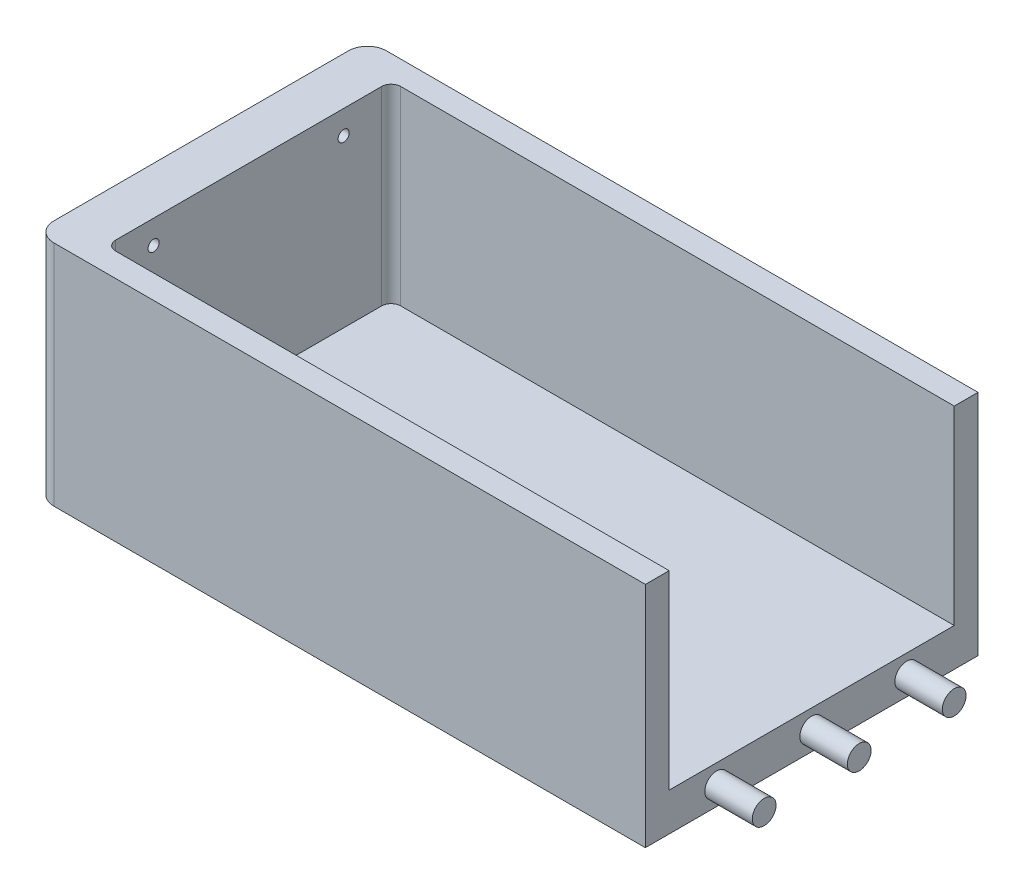
ISO-10303-21;
HEADER;
FILE_DESCRIPTION(('STEP AP214'),'2;1');
FILE_NAME('part.step','',(''),(''),'','','');
FILE_SCHEMA(('AUTOMOTIVE_DESIGN { 1 0 10303 214 1 1 1 1 }'));
ENDSEC;
DATA;
#1=APPLICATION_CONTEXT('core data for automotive mechanical design processes');
#2=APPLICATION_PROTOCOL_DEFINITION('international standard','automotive_design',2000,#1);
#3=PRODUCT_CONTEXT('',#1,'mechanical');
#4=PRODUCT('Part','Part','',(#3));
#5=PRODUCT_RELATED_PRODUCT_CATEGORY('part','',(#4));
#6=PRODUCT_DEFINITION_FORMATION('','',#4);
#7=PRODUCT_DEFINITION_CONTEXT('part definition',#1,'design');
#8=PRODUCT_DEFINITION('design','',#6,#7);
#9=PRODUCT_DEFINITION_SHAPE('','',#8);
#10=(LENGTH_UNIT() NAMED_UNIT(*) SI_UNIT(.MILLI.,.METRE.));
#11=(NAMED_UNIT(*) PLANE_ANGLE_UNIT() SI_UNIT($,.RADIAN.));
#12=(NAMED_UNIT(*) SI_UNIT($,.STERADIAN.) SOLID_ANGLE_UNIT());
#13=UNCERTAINTY_MEASURE_WITH_UNIT(LENGTH_MEASURE(1.E-05),#10,'distance_accuracy_value','');
#14=(GEOMETRIC_REPRESENTATION_CONTEXT(3) GLOBAL_UNCERTAINTY_ASSIGNED_CONTEXT((#13)) GLOBAL_UNIT_ASSIGNED_CONTEXT((#10,
#11,#12)) REPRESENTATION_CONTEXT('',''));
#15=CARTESIAN_POINT('',(0.,0.,0.));
#16=DIRECTION('',(0.,0.,1.));
#17=DIRECTION('',(1.,0.,0.));
#18=AXIS2_PLACEMENT_3D('',#15,#16,#17);
#19=CARTESIAN_POINT('',(0.,0.,0.));
#20=DIRECTION('',(1.,0.,0.));
#21=DIRECTION('',(0.,0.,-1.));
#22=AXIS2_PLACEMENT_3D('',#19,#20,#21);
#23=PLANE('',#22);
#24=CARTESIAN_POINT('',(0.,-5.08000000000021,-25.4));
#25=DIRECTION('',(1.,0.,0.));
#26=DIRECTION('',(0.,0.,1.));
#27=AXIS2_PLACEMENT_3D('',#24,#25,#26);
#28=CIRCLE('',#27,3.175);
#29=CARTESIAN_POINT('',(0.,-5.08000000000021,-22.225));
#30=VERTEX_POINT('',#29);
#31=EDGE_CURVE('E526',#30,#30,#28,.T.);
#32=ORIENTED_EDGE('',*,*,#31,.F.);
#33=EDGE_LOOP('',(#32));
#34=FACE_BOUND('',#33,.T.);
#35=CARTESIAN_POINT('',(0.,-5.08000000000018,25.4));
#36=DIRECTION('',(1.,0.,0.));
#37=DIRECTION('',(0.,0.,-1.));
#38=AXIS2_PLACEMENT_3D('',#35,#36,#37);
#39=CIRCLE('',#38,3.175);
#40=CARTESIAN_POINT('',(0.,-5.08000000000018,22.225));
#41=VERTEX_POINT('',#40);
#42=EDGE_CURVE('E518',#41,#41,#39,.T.);
#43=ORIENTED_EDGE('',*,*,#42,.F.);
#44=EDGE_LOOP('',(#43));
#45=FACE_BOUND('',#44,.T.);
#46=CARTESIAN_POINT('',(0.,-5.08,0.));
#47=DIRECTION('',(1.,0.,0.));
#48=DIRECTION('',(0.,0.,-1.));
#49=AXIS2_PLACEMENT_3D('',#46,#47,#48);
#50=CIRCLE('',#49,3.175);
#51=CARTESIAN_POINT('',(0.,-5.08,-3.175));
#52=VERTEX_POINT('',#51);
#53=EDGE_CURVE('E175',#52,#52,#50,.T.);
#54=ORIENTED_EDGE('',*,*,#53,.F.);
#55=EDGE_LOOP('',(#54));
#56=FACE_BOUND('',#55,.T.);
#57=DIRECTION('',(0.,1.,0.));
#58=VECTOR('',#57,1.);
#59=CARTESIAN_POINT('',(0.,50.8,-38.0999999999999));
#60=LINE('',#59,#58);
#61=CARTESIAN_POINT('',(0.,0.,-38.0999999999999));
#62=VERTEX_POINT('',#61);
#63=CARTESIAN_POINT('',(0.,50.8,-38.0999999999999));
#64=VERTEX_POINT('',#63);
#65=EDGE_CURVE('E161',#62,#64,#60,.T.);
#66=ORIENTED_EDGE('',*,*,#65,.F.);
#67=DIRECTION('',(0.,0.,1.));
#68=VECTOR('',#67,1.);
#69=CARTESIAN_POINT('',(0.,0.,0.));
#70=LINE('',#69,#68);
#71=CARTESIAN_POINT('',(0.,0.,38.1));
#72=VERTEX_POINT('',#71);
#73=EDGE_CURVE('E142',#62,#72,#70,.T.);
#74=ORIENTED_EDGE('',*,*,#73,.T.);
#75=DIRECTION('',(0.,-1.,0.));
#76=VECTOR('',#75,1.);
#77=CARTESIAN_POINT('',(0.,50.8,38.1));
#78=LINE('',#77,#76);
#79=CARTESIAN_POINT('',(0.,50.8,38.1));
#80=VERTEX_POINT('',#79);
#81=EDGE_CURVE('E152',#80,#72,#78,.T.);
#82=ORIENTED_EDGE('',*,*,#81,.F.);
#83=DIRECTION('',(0.,0.,1.));
#84=VECTOR('',#83,1.);
#85=CARTESIAN_POINT('',(0.,50.8,0.));
#86=LINE('',#85,#84);
#87=CARTESIAN_POINT('',(0.,50.8,44.45));
#88=VERTEX_POINT('',#87);
#89=EDGE_CURVE('E222',#80,#88,#86,.T.);
#90=ORIENTED_EDGE('',*,*,#89,.T.);
#91=DIRECTION('',(0.,-1.,0.));
#92=VECTOR('',#91,1.);
#93=CARTESIAN_POINT('',(0.,50.8,44.45));
#94=LINE('',#93,#92);
#95=CARTESIAN_POINT('',(0.,-10.16,44.45));
#96=VERTEX_POINT('',#95);
#97=EDGE_CURVE('E166',#88,#96,#94,.T.);
#98=ORIENTED_EDGE('',*,*,#97,.T.);
#99=DIRECTION('',(0.,0.,1.));
#100=VECTOR('',#99,1.);
#101=CARTESIAN_POINT('',(0.,-10.16,0.));
#102=LINE('',#101,#100);
#103=CARTESIAN_POINT('',(0.,-10.16,-44.45));
#104=VERTEX_POINT('',#103);
#105=EDGE_CURVE('E160',#104,#96,#102,.T.);
#106=ORIENTED_EDGE('',*,*,#105,.F.);
#107=DIRECTION('',(0.,1.,0.));
#108=VECTOR('',#107,1.);
#109=CARTESIAN_POINT('',(0.,50.8,-44.45));
#110=LINE('',#109,#108);
#111=CARTESIAN_POINT('',(0.,50.8,-44.45));
#112=VERTEX_POINT('',#111);
#113=EDGE_CURVE('E172',#104,#112,#110,.T.);
#114=ORIENTED_EDGE('',*,*,#113,.T.);
#115=EDGE_CURVE('E221',#112,#64,#86,.T.);
#116=ORIENTED_EDGE('',*,*,#115,.T.);
#117=EDGE_LOOP('',(#66,#74,#82,#90,#98,#106,#114,#116));
#118=FACE_BOUND('',#117,.T.);
#119=ADVANCED_FACE('F45',(#34,#45,#56,#118),#23,.T.);
#120=CARTESIAN_POINT('',(0.,50.8,0.));
#121=DIRECTION('',(0.,-1.,0.));
#122=DIRECTION('',(0.,0.,-1.));
#123=AXIS2_PLACEMENT_3D('',#120,#121,#122);
#124=PLANE('',#123);
#125=ORIENTED_EDGE('',*,*,#115,.F.);
#126=DIRECTION('',(-1.,0.,0.));
#127=VECTOR('',#126,1.);
#128=CARTESIAN_POINT('',(-163.195,50.8,-44.45));
#129=LINE('',#128,#127);
#130=CARTESIAN_POINT('',(-158.115,50.8,-44.45));
#131=VERTEX_POINT('',#130);
#132=EDGE_CURVE('E71',#112,#131,#129,.T.);
#133=ORIENTED_EDGE('',*,*,#132,.T.);
#134=CARTESIAN_POINT('',(-158.115,50.8,-39.37));
#135=DIRECTION('',(0.,-1.,0.));
#136=DIRECTION('',(0.,0.,-1.));
#137=AXIS2_PLACEMENT_3D('',#134,#135,#136);
#138=CIRCLE('',#137,5.08);
#139=CARTESIAN_POINT('',(-163.195,50.8,-39.37));
#140=VERTEX_POINT('',#139);
#141=EDGE_CURVE('E241',#131,#140,#138,.F.);
#142=ORIENTED_EDGE('',*,*,#141,.T.);
#143=DIRECTION('',(0.,0.,1.));
#144=VECTOR('',#143,1.);
#145=CARTESIAN_POINT('',(-163.195,50.8,44.4500000000001));
#146=LINE('',#145,#144);
#147=CARTESIAN_POINT('',(-163.195,50.8,39.3700000000001));
#148=VERTEX_POINT('',#147);
#149=EDGE_CURVE('E182',#140,#148,#146,.T.);
#150=ORIENTED_EDGE('',*,*,#149,.T.);
#151=CARTESIAN_POINT('',(-158.115,50.8,39.3700000000001));
#152=DIRECTION('',(0.,-1.,0.));
#153=DIRECTION('',(0.,0.,-1.));
#154=AXIS2_PLACEMENT_3D('',#151,#152,#153);
#155=CIRCLE('',#154,5.08);
#156=CARTESIAN_POINT('',(-158.115,50.8,44.4500000000001));
#157=VERTEX_POINT('',#156);
#158=EDGE_CURVE('E246',#148,#157,#155,.F.);
#159=ORIENTED_EDGE('',*,*,#158,.T.);
#160=DIRECTION('',(1.,0.,0.));
#161=VECTOR('',#160,1.);
#162=CARTESIAN_POINT('',(-163.195,50.8,44.4500000000001));
#163=LINE('',#162,#161);
#164=EDGE_CURVE('E179',#157,#88,#163,.T.);
#165=ORIENTED_EDGE('',*,*,#164,.T.);
#166=ORIENTED_EDGE('',*,*,#89,.F.);
#167=DIRECTION('',(1.,0.,0.));
#168=VECTOR('',#167,1.);
#169=CARTESIAN_POINT('',(-150.495,50.8,38.1));
#170=LINE('',#169,#168);
#171=CARTESIAN_POINT('',(-147.955,50.8,38.1));
#172=VERTEX_POINT('',#171);
#173=EDGE_CURVE('E155',#172,#80,#170,.T.);
#174=ORIENTED_EDGE('',*,*,#173,.F.);
#175=CARTESIAN_POINT('',(-147.955,50.8,35.56));
#176=DIRECTION('',(0.,-1.,0.));
#177=DIRECTION('',(0.,0.,-1.));
#178=AXIS2_PLACEMENT_3D('',#175,#176,#177);
#179=CIRCLE('',#178,2.54);
#180=CARTESIAN_POINT('',(-150.495,50.8,35.56));
#181=VERTEX_POINT('',#180);
#182=EDGE_CURVE('E289',#172,#181,#179,.T.);
#183=ORIENTED_EDGE('',*,*,#182,.T.);
#184=DIRECTION('',(0.,0.,1.));
#185=VECTOR('',#184,1.);
#186=CARTESIAN_POINT('',(-150.495,50.8,38.1));
#187=LINE('',#186,#185);
#188=CARTESIAN_POINT('',(-150.495,50.8,-35.5599999999999));
#189=VERTEX_POINT('',#188);
#190=EDGE_CURVE('E188',#189,#181,#187,.T.);
#191=ORIENTED_EDGE('',*,*,#190,.F.);
#192=CARTESIAN_POINT('',(-147.955,50.8,-35.5599999999999));
#193=DIRECTION('',(0.,-1.,0.));
#194=DIRECTION('',(0.,0.,-1.));
#195=AXIS2_PLACEMENT_3D('',#192,#193,#194);
#196=CIRCLE('',#195,2.54);
#197=CARTESIAN_POINT('',(-147.955,50.8,-38.0999999999999));
#198=VERTEX_POINT('',#197);
#199=EDGE_CURVE('E217',#189,#198,#196,.T.);
#200=ORIENTED_EDGE('',*,*,#199,.T.);
#201=DIRECTION('',(-1.,0.,0.));
#202=VECTOR('',#201,1.);
#203=CARTESIAN_POINT('',(-150.495,50.8,-38.0999999999999));
#204=LINE('',#203,#202);
#205=EDGE_CURVE('E149',#64,#198,#204,.T.);
#206=ORIENTED_EDGE('',*,*,#205,.F.);
#207=EDGE_LOOP('',(#125,#133,#142,#150,#159,#165,#166,#174,#183,#191,#200,#206));
#208=FACE_BOUND('',#207,.T.);
#209=ADVANCED_FACE('F310',(#208),#124,.F.);
#210=CARTESIAN_POINT('',(-150.495,50.8,38.1));
#211=DIRECTION('',(0.,0.,-1.));
#212=DIRECTION('',(-1.,0.,0.));
#213=AXIS2_PLACEMENT_3D('',#210,#211,#212);
#214=PLANE('',#213);
#215=ORIENTED_EDGE('',*,*,#173,.T.);
#216=ORIENTED_EDGE('',*,*,#81,.T.);
#217=DIRECTION('',(1.,0.,0.));
#218=VECTOR('',#217,1.);
#219=CARTESIAN_POINT('',(-150.495,0.,38.1));
#220=LINE('',#219,#218);
#221=CARTESIAN_POINT('',(-147.955,0.,38.1));
#222=VERTEX_POINT('',#221);
#223=EDGE_CURVE('E138',#222,#72,#220,.T.);
#224=ORIENTED_EDGE('',*,*,#223,.F.);
#225=DIRECTION('',(0.,-1.,0.));
#226=VECTOR('',#225,1.);
#227=CARTESIAN_POINT('',(-147.955,50.8,38.1));
#228=LINE('',#227,#226);
#229=EDGE_CURVE('E297',#222,#172,#228,.F.);
#230=ORIENTED_EDGE('',*,*,#229,.T.);
#231=EDGE_LOOP('',(#215,#216,#224,#230));
#232=FACE_BOUND('',#231,.T.);
#233=ADVANCED_FACE('F153',(#232),#214,.T.);
#234=CARTESIAN_POINT('',(-147.955,50.8,35.56));
#235=DIRECTION('',(0.,1.,0.));
#236=DIRECTION('',(0.,0.,1.));
#237=AXIS2_PLACEMENT_3D('',#234,#235,#236);
#238=CYLINDRICAL_SURFACE('',#237,2.54);
#239=ORIENTED_EDGE('',*,*,#182,.F.);
#240=ORIENTED_EDGE('',*,*,#229,.F.);
#241=CARTESIAN_POINT('',(-147.955,0.,35.56));
#242=DIRECTION('',(0.,-1.,0.));
#243=DIRECTION('',(0.,0.,-1.));
#244=AXIS2_PLACEMENT_3D('',#241,#242,#243);
#245=CIRCLE('',#244,2.54);
#246=CARTESIAN_POINT('',(-150.495,0.,35.56));
#247=VERTEX_POINT('',#246);
#248=EDGE_CURVE('E144',#247,#222,#245,.F.);
#249=ORIENTED_EDGE('',*,*,#248,.F.);
#250=DIRECTION('',(0.,-1.,0.));
#251=VECTOR('',#250,1.);
#252=CARTESIAN_POINT('',(-150.495,0.,35.56));
#253=LINE('',#252,#251);
#254=EDGE_CURVE('E276',#181,#247,#253,.T.);
#255=ORIENTED_EDGE('',*,*,#254,.F.);
#256=EDGE_LOOP('',(#239,#240,#249,#255));
#257=FACE_BOUND('',#256,.T.);
#258=ADVANCED_FACE('F328',(#257),#238,.F.);
#259=CARTESIAN_POINT('',(-150.495,50.8,38.1));
#260=DIRECTION('',(1.,0.,0.));
#261=DIRECTION('',(0.,0.,-1.));
#262=AXIS2_PLACEMENT_3D('',#259,#260,#261);
#263=PLANE('',#262);
#264=ORIENTED_EDGE('',*,*,#190,.T.);
#265=ORIENTED_EDGE('',*,*,#254,.T.);
#266=DIRECTION('',(0.,0.,1.));
#267=VECTOR('',#266,1.);
#268=CARTESIAN_POINT('',(-150.495,0.,38.1));
#269=LINE('',#268,#267);
#270=CARTESIAN_POINT('',(-150.495,0.,-35.5599999999999));
#271=VERTEX_POINT('',#270);
#272=EDGE_CURVE('E148',#271,#247,#269,.T.);
#273=ORIENTED_EDGE('',*,*,#272,.F.);
#274=DIRECTION('',(0.,-1.,0.));
#275=VECTOR('',#274,1.);
#276=CARTESIAN_POINT('',(-150.495,50.8,-35.5599999999999));
#277=LINE('',#276,#275);
#278=EDGE_CURVE('E273',#271,#189,#277,.F.);
#279=ORIENTED_EDGE('',*,*,#278,.T.);
#280=EDGE_LOOP('',(#264,#265,#273,#279));
#281=FACE_BOUND('',#280,.T.);
#282=CARTESIAN_POINT('',(-150.495,44.45,-25.4));
#283=DIRECTION('',(1.,0.,0.));
#284=DIRECTION('',(0.,0.,-1.));
#285=AXIS2_PLACEMENT_3D('',#282,#283,#284);
#286=CIRCLE('',#285,1.4859);
#287=CARTESIAN_POINT('',(-150.495,44.45,-26.8859));
#288=VERTEX_POINT('',#287);
#289=EDGE_CURVE('E505',#288,#288,#286,.T.);
#290=ORIENTED_EDGE('',*,*,#289,.F.);
#291=EDGE_LOOP('',(#290));
#292=FACE_BOUND('',#291,.T.);
#293=CARTESIAN_POINT('',(-150.495,44.45,25.4));
#294=DIRECTION('',(1.,0.,0.));
#295=DIRECTION('',(0.,0.,-1.));
#296=AXIS2_PLACEMENT_3D('',#293,#294,#295);
#297=CIRCLE('',#296,1.4859);
#298=CARTESIAN_POINT('',(-150.495,44.45,23.9141));
#299=VERTEX_POINT('',#298);
#300=EDGE_CURVE('E502',#299,#299,#297,.T.);
#301=ORIENTED_EDGE('',*,*,#300,.F.);
#302=EDGE_LOOP('',(#301));
#303=FACE_BOUND('',#302,.T.);
#304=ADVANCED_FACE('F271',(#281,#292,#303),#263,.T.);
#305=CARTESIAN_POINT('',(-147.955,50.8,-35.5599999999999));
#306=DIRECTION('',(0.,1.,0.));
#307=DIRECTION('',(0.,0.,1.));
#308=AXIS2_PLACEMENT_3D('',#305,#306,#307);
#309=CYLINDRICAL_SURFACE('',#308,2.54);
#310=ORIENTED_EDGE('',*,*,#199,.F.);
#311=ORIENTED_EDGE('',*,*,#278,.F.);
#312=CARTESIAN_POINT('',(-147.955,0.,-35.5599999999999));
#313=DIRECTION('',(0.,-1.,0.));
#314=DIRECTION('',(0.,0.,-1.));
#315=AXIS2_PLACEMENT_3D('',#312,#313,#314);
#316=CIRCLE('',#315,2.54);
#317=CARTESIAN_POINT('',(-147.955,0.,-38.0999999999999));
#318=VERTEX_POINT('',#317);
#319=EDGE_CURVE('E266',#318,#271,#316,.F.);
#320=ORIENTED_EDGE('',*,*,#319,.F.);
#321=DIRECTION('',(0.,-1.,0.));
#322=VECTOR('',#321,1.);
#323=CARTESIAN_POINT('',(-147.955,0.,-38.0999999999999));
#324=LINE('',#323,#322);
#325=EDGE_CURVE('E284',#198,#318,#324,.T.);
#326=ORIENTED_EDGE('',*,*,#325,.F.);
#327=EDGE_LOOP('',(#310,#311,#320,#326));
#328=FACE_BOUND('',#327,.T.);
#329=ADVANCED_FACE('F279',(#328),#309,.F.);
#330=CARTESIAN_POINT('',(-150.495,50.8,-38.0999999999999));
#331=DIRECTION('',(0.,0.,1.));
#332=DIRECTION('',(1.,0.,0.));
#333=AXIS2_PLACEMENT_3D('',#330,#331,#332);
#334=PLANE('',#333);
#335=DIRECTION('',(-1.,0.,0.));
#336=VECTOR('',#335,1.);
#337=CARTESIAN_POINT('',(-150.495,0.,-38.0999999999999));
#338=LINE('',#337,#336);
#339=EDGE_CURVE('E191',#62,#318,#338,.T.);
#340=ORIENTED_EDGE('',*,*,#339,.F.);
#341=ORIENTED_EDGE('',*,*,#65,.T.);
#342=ORIENTED_EDGE('',*,*,#205,.T.);
#343=ORIENTED_EDGE('',*,*,#325,.T.);
#344=EDGE_LOOP('',(#340,#341,#342,#343));
#345=FACE_BOUND('',#344,.T.);
#346=ADVANCED_FACE('F339',(#345),#334,.T.);
#347=CARTESIAN_POINT('',(-158.115,50.8,-39.37));
#348=DIRECTION('',(0.,-1.,0.));
#349=DIRECTION('',(0.,0.,-1.));
#350=AXIS2_PLACEMENT_3D('',#347,#348,#349);
#351=CYLINDRICAL_SURFACE('',#350,5.08);
#352=ORIENTED_EDGE('',*,*,#141,.F.);
#353=DIRECTION('',(0.,-1.,0.));
#354=VECTOR('',#353,1.);
#355=CARTESIAN_POINT('',(-158.115,50.8,-44.45));
#356=LINE('',#355,#354);
#357=CARTESIAN_POINT('',(-158.115,-10.16,-44.45));
#358=VERTEX_POINT('',#357);
#359=EDGE_CURVE('E183',#358,#131,#356,.F.);
#360=ORIENTED_EDGE('',*,*,#359,.F.);
#361=CARTESIAN_POINT('',(-158.115,-10.16,-39.37));
#362=DIRECTION('',(0.,-1.,0.));
#363=DIRECTION('',(0.,0.,-1.));
#364=AXIS2_PLACEMENT_3D('',#361,#362,#363);
#365=CIRCLE('',#364,5.08);
#366=CARTESIAN_POINT('',(-163.195,-10.16,-39.37));
#367=VERTEX_POINT('',#366);
#368=EDGE_CURVE('E63',#367,#358,#365,.T.);
#369=ORIENTED_EDGE('',*,*,#368,.F.);
#370=DIRECTION('',(0.,-1.,0.));
#371=VECTOR('',#370,1.);
#372=CARTESIAN_POINT('',(-163.195,50.8,-39.37));
#373=LINE('',#372,#371);
#374=EDGE_CURVE('E248',#140,#367,#373,.T.);
#375=ORIENTED_EDGE('',*,*,#374,.F.);
#376=EDGE_LOOP('',(#352,#360,#369,#375));
#377=FACE_BOUND('',#376,.T.);
#378=ADVANCED_FACE('F309',(#377),#351,.T.);
#379=CARTESIAN_POINT('',(-163.195,50.8,44.4500000000001));
#380=DIRECTION('',(1.,0.,0.));
#381=DIRECTION('',(0.,0.,-1.));
#382=AXIS2_PLACEMENT_3D('',#379,#380,#381);
#383=PLANE('',#382);
#384=ORIENTED_EDGE('',*,*,#149,.F.);
#385=ORIENTED_EDGE('',*,*,#374,.T.);
#386=DIRECTION('',(0.,0.,-1.));
#387=VECTOR('',#386,1.);
#388=CARTESIAN_POINT('',(-163.195,-10.16,44.4500000000001));
#389=LINE('',#388,#387);
#390=CARTESIAN_POINT('',(-163.195,-10.16,39.3700000000001));
#391=VERTEX_POINT('',#390);
#392=EDGE_CURVE('E193',#391,#367,#389,.T.);
#393=ORIENTED_EDGE('',*,*,#392,.F.);
#394=DIRECTION('',(0.,-1.,0.));
#395=VECTOR('',#394,1.);
#396=CARTESIAN_POINT('',(-163.195,50.8,39.3700000000001));
#397=LINE('',#396,#395);
#398=EDGE_CURVE('E242',#391,#148,#397,.F.);
#399=ORIENTED_EDGE('',*,*,#398,.T.);
#400=EDGE_LOOP('',(#384,#385,#393,#399));
#401=FACE_BOUND('',#400,.T.);
#402=CARTESIAN_POINT('',(-163.195,44.45,-25.4));
#403=DIRECTION('',(1.,0.,0.));
#404=DIRECTION('',(0.,0.,-1.));
#405=AXIS2_PLACEMENT_3D('',#402,#403,#404);
#406=CIRCLE('',#405,1.4859);
#407=CARTESIAN_POINT('',(-163.195,44.45,-26.8859));
#408=VERTEX_POINT('',#407);
#409=EDGE_CURVE('E512',#408,#408,#406,.F.);
#410=ORIENTED_EDGE('',*,*,#409,.F.);
#411=EDGE_LOOP('',(#410));
#412=FACE_BOUND('',#411,.T.);
#413=CARTESIAN_POINT('',(-163.195,44.45,25.4));
#414=DIRECTION('',(1.,0.,0.));
#415=DIRECTION('',(0.,0.,-1.));
#416=AXIS2_PLACEMENT_3D('',#413,#414,#415);
#417=CIRCLE('',#416,1.4859);
#418=CARTESIAN_POINT('',(-163.195,44.45,23.9141));
#419=VERTEX_POINT('',#418);
#420=EDGE_CURVE('E499',#419,#419,#417,.F.);
#421=ORIENTED_EDGE('',*,*,#420,.F.);
#422=EDGE_LOOP('',(#421));
#423=FACE_BOUND('',#422,.T.);
#424=ADVANCED_FACE('F304',(#401,#412,#423),#383,.F.);
#425=CARTESIAN_POINT('',(-158.115,50.8,39.3700000000001));
#426=DIRECTION('',(0.,-1.,0.));
#427=DIRECTION('',(0.,0.,-1.));
#428=AXIS2_PLACEMENT_3D('',#425,#426,#427);
#429=CYLINDRICAL_SURFACE('',#428,5.08);
#430=ORIENTED_EDGE('',*,*,#158,.F.);
#431=ORIENTED_EDGE('',*,*,#398,.F.);
#432=CARTESIAN_POINT('',(-158.115,-10.16,39.3700000000001));
#433=DIRECTION('',(0.,-1.,0.));
#434=DIRECTION('',(0.,0.,-1.));
#435=AXIS2_PLACEMENT_3D('',#432,#433,#434);
#436=CIRCLE('',#435,5.08);
#437=CARTESIAN_POINT('',(-158.115,-10.16,44.4500000000001));
#438=VERTEX_POINT('',#437);
#439=EDGE_CURVE('E256',#438,#391,#436,.T.);
#440=ORIENTED_EDGE('',*,*,#439,.F.);
#441=DIRECTION('',(0.,-1.,0.));
#442=VECTOR('',#441,1.);
#443=CARTESIAN_POINT('',(-158.115,50.8,44.4500000000001));
#444=LINE('',#443,#442);
#445=EDGE_CURVE('E237',#157,#438,#444,.T.);
#446=ORIENTED_EDGE('',*,*,#445,.F.);
#447=EDGE_LOOP('',(#430,#431,#440,#446));
#448=FACE_BOUND('',#447,.T.);
#449=ADVANCED_FACE('F311',(#448),#429,.T.);
#450=CARTESIAN_POINT('',(-163.195,50.8,44.4500000000001));
#451=DIRECTION('',(0.,0.,-1.));
#452=DIRECTION('',(-1.,0.,0.));
#453=AXIS2_PLACEMENT_3D('',#450,#451,#452);
#454=PLANE('',#453);
#455=ORIENTED_EDGE('',*,*,#97,.F.);
#456=ORIENTED_EDGE('',*,*,#164,.F.);
#457=ORIENTED_EDGE('',*,*,#445,.T.);
#458=DIRECTION('',(-1.,0.,0.));
#459=VECTOR('',#458,1.);
#460=CARTESIAN_POINT('',(163.195,-10.16,44.45));
#461=LINE('',#460,#459);
#462=EDGE_CURVE('E194',#96,#438,#461,.T.);
#463=ORIENTED_EDGE('',*,*,#462,.F.);
#464=EDGE_LOOP('',(#455,#456,#457,#463));
#465=FACE_BOUND('',#464,.T.);
#466=ADVANCED_FACE('F235',(#465),#454,.F.);
#467=CARTESIAN_POINT('',(-163.195,50.8,-44.45));
#468=DIRECTION('',(0.,0.,1.));
#469=DIRECTION('',(1.,0.,0.));
#470=AXIS2_PLACEMENT_3D('',#467,#468,#469);
#471=PLANE('',#470);
#472=ORIENTED_EDGE('',*,*,#113,.F.);
#473=DIRECTION('',(1.,0.,0.));
#474=VECTOR('',#473,1.);
#475=CARTESIAN_POINT('',(-163.195,-10.16,-44.45));
#476=LINE('',#475,#474);
#477=EDGE_CURVE('E49',#358,#104,#476,.T.);
#478=ORIENTED_EDGE('',*,*,#477,.F.);
#479=ORIENTED_EDGE('',*,*,#359,.T.);
#480=ORIENTED_EDGE('',*,*,#132,.F.);
#481=EDGE_LOOP('',(#472,#478,#479,#480));
#482=FACE_BOUND('',#481,.T.);
#483=ADVANCED_FACE('F229',(#482),#471,.F.);
#484=CARTESIAN_POINT('',(-106.,50.8,-7.49999999999999));
#485=DIRECTION('',(0.,-1.,0.));
#486=DIRECTION('',(0.,0.,-1.));
#487=AXIS2_PLACEMENT_3D('',#484,#485,#486);
#488=CYLINDRICAL_SURFACE('',#487,3.1);
#489=CARTESIAN_POINT('',(-106.,-10.16,-7.49999999999999));
#490=DIRECTION('',(0.,-1.,0.));
#491=DIRECTION('',(0.,0.,1.));
#492=AXIS2_PLACEMENT_3D('',#489,#490,#491);
#493=CIRCLE('',#492,3.1);
#494=CARTESIAN_POINT('',(-106.,-10.16,-4.39999999999999));
#495=VERTEX_POINT('',#494);
#496=EDGE_CURVE('E11',#495,#495,#493,.T.);
#497=ORIENTED_EDGE('',*,*,#496,.T.);
#498=EDGE_LOOP('',(#497));
#499=FACE_BOUND('',#498,.T.);
#500=CARTESIAN_POINT('',(-106.,0.,-7.49999999999999));
#501=DIRECTION('',(0.,-1.,0.));
#502=DIRECTION('',(0.,0.,-1.));
#503=AXIS2_PLACEMENT_3D('',#500,#501,#502);
#504=CIRCLE('',#503,3.1);
#505=CARTESIAN_POINT('',(-106.,0.,-10.6));
#506=VERTEX_POINT('',#505);
#507=EDGE_CURVE('E209',#506,#506,#504,.T.);
#508=ORIENTED_EDGE('',*,*,#507,.F.);
#509=EDGE_LOOP('',(#508));
#510=FACE_BOUND('',#509,.T.);
#511=ADVANCED_FACE('F337',(#499,#510),#488,.F.);
#512=CARTESIAN_POINT('',(-106.,50.8,7.49999999999999));
#513=DIRECTION('',(0.,-1.,0.));
#514=DIRECTION('',(0.,0.,-1.));
#515=AXIS2_PLACEMENT_3D('',#512,#513,#514);
#516=CYLINDRICAL_SURFACE('',#515,3.1);
#517=CARTESIAN_POINT('',(-106.,-10.16,7.49999999999999));
#518=DIRECTION('',(0.,-1.,0.));
#519=DIRECTION('',(0.,0.,-1.));
#520=AXIS2_PLACEMENT_3D('',#517,#518,#519);
#521=CIRCLE('',#520,3.1);
#522=CARTESIAN_POINT('',(-106.,-10.16,4.39999999999999));
#523=VERTEX_POINT('',#522);
#524=EDGE_CURVE('E55',#523,#523,#521,.T.);
#525=ORIENTED_EDGE('',*,*,#524,.T.);
#526=EDGE_LOOP('',(#525));
#527=FACE_BOUND('',#526,.T.);
#528=CARTESIAN_POINT('',(-106.,0.,7.49999999999999));
#529=DIRECTION('',(0.,-1.,0.));
#530=DIRECTION('',(0.,0.,-1.));
#531=AXIS2_PLACEMENT_3D('',#528,#529,#530);
#532=CIRCLE('',#531,3.1);
#533=CARTESIAN_POINT('',(-106.,0.,4.39999999999999));
#534=VERTEX_POINT('',#533);
#535=EDGE_CURVE('E200',#534,#534,#532,.T.);
#536=ORIENTED_EDGE('',*,*,#535,.F.);
#537=EDGE_LOOP('',(#536));
#538=FACE_BOUND('',#537,.T.);
#539=ADVANCED_FACE('F351',(#527,#538),#516,.F.);
#540=CARTESIAN_POINT('',(0.,-10.16,0.));
#541=DIRECTION('',(0.,-1.,0.));
#542=DIRECTION('',(0.,0.,-1.));
#543=AXIS2_PLACEMENT_3D('',#540,#541,#542);
#544=PLANE('',#543);
#545=ORIENTED_EDGE('',*,*,#524,.F.);
#546=EDGE_LOOP('',(#545));
#547=FACE_BOUND('',#546,.T.);
#548=ORIENTED_EDGE('',*,*,#496,.F.);
#549=EDGE_LOOP('',(#548));
#550=FACE_BOUND('',#549,.T.);
#551=ORIENTED_EDGE('',*,*,#477,.T.);
#552=ORIENTED_EDGE('',*,*,#105,.T.);
#553=ORIENTED_EDGE('',*,*,#462,.T.);
#554=ORIENTED_EDGE('',*,*,#439,.T.);
#555=ORIENTED_EDGE('',*,*,#392,.T.);
#556=ORIENTED_EDGE('',*,*,#368,.T.);
#557=EDGE_LOOP('',(#551,#552,#553,#554,#555,#556));
#558=FACE_BOUND('',#557,.T.);
#559=ADVANCED_FACE('F47',(#547,#550,#558),#544,.T.);
#560=CARTESIAN_POINT('',(0.,0.,0.));
#561=DIRECTION('',(0.,-1.,0.));
#562=DIRECTION('',(0.,0.,-1.));
#563=AXIS2_PLACEMENT_3D('',#560,#561,#562);
#564=PLANE('',#563);
#565=ORIENTED_EDGE('',*,*,#507,.T.);
#566=EDGE_LOOP('',(#565));
#567=FACE_BOUND('',#566,.T.);
#568=ORIENTED_EDGE('',*,*,#535,.T.);
#569=EDGE_LOOP('',(#568));
#570=FACE_BOUND('',#569,.T.);
#571=ORIENTED_EDGE('',*,*,#73,.F.);
#572=ORIENTED_EDGE('',*,*,#339,.T.);
#573=ORIENTED_EDGE('',*,*,#319,.T.);
#574=ORIENTED_EDGE('',*,*,#272,.T.);
#575=ORIENTED_EDGE('',*,*,#248,.T.);
#576=ORIENTED_EDGE('',*,*,#223,.T.);
#577=EDGE_LOOP('',(#571,#572,#573,#574,#575,#576));
#578=FACE_BOUND('',#577,.T.);
#579=ADVANCED_FACE('F140',(#567,#570,#578),#564,.F.);
#580=CARTESIAN_POINT('',(12.7,-5.08,0.));
#581=DIRECTION('',(-1.,0.,0.));
#582=DIRECTION('',(0.,0.,1.));
#583=AXIS2_PLACEMENT_3D('',#580,#581,#582);
#584=CYLINDRICAL_SURFACE('',#583,3.175);
#585=CARTESIAN_POINT('',(12.7,-5.08,0.));
#586=DIRECTION('',(1.,0.,0.));
#587=DIRECTION('',(0.,0.,-1.));
#588=AXIS2_PLACEMENT_3D('',#585,#586,#587);
#589=CIRCLE('',#588,3.175);
#590=CARTESIAN_POINT('',(12.7,-5.08,-3.175));
#591=VERTEX_POINT('',#590);
#592=EDGE_CURVE('E167',#591,#591,#589,.T.);
#593=ORIENTED_EDGE('',*,*,#592,.F.);
#594=EDGE_LOOP('',(#593));
#595=FACE_BOUND('',#594,.T.);
#596=ORIENTED_EDGE('',*,*,#53,.T.);
#597=EDGE_LOOP('',(#596));
#598=FACE_BOUND('',#597,.T.);
#599=ADVANCED_FACE('F333',(#595,#598),#584,.T.);
#600=CARTESIAN_POINT('',(12.7,-5.08,0.));
#601=DIRECTION('',(1.,0.,0.));
#602=DIRECTION('',(0.,0.,-1.));
#603=AXIS2_PLACEMENT_3D('',#600,#601,#602);
#604=PLANE('',#603);
#605=ORIENTED_EDGE('',*,*,#592,.T.);
#606=EDGE_LOOP('',(#605));
#607=FACE_BOUND('',#606,.T.);
#608=ADVANCED_FACE('F348',(#607),#604,.T.);
#609=CARTESIAN_POINT('',(12.7,-5.08000000000018,25.4));
#610=DIRECTION('',(-1.,0.,0.));
#611=DIRECTION('',(0.,0.,1.));
#612=AXIS2_PLACEMENT_3D('',#609,#610,#611);
#613=CYLINDRICAL_SURFACE('',#612,3.175);
#614=CARTESIAN_POINT('',(12.7,-5.08000000000018,25.4));
#615=DIRECTION('',(1.,0.,0.));
#616=DIRECTION('',(0.,0.,-1.));
#617=AXIS2_PLACEMENT_3D('',#614,#615,#616);
#618=CIRCLE('',#617,3.175);
#619=CARTESIAN_POINT('',(12.7,-5.08000000000018,22.225));
#620=VERTEX_POINT('',#619);
#621=EDGE_CURVE('E522',#620,#620,#618,.T.);
#622=ORIENTED_EDGE('',*,*,#621,.F.);
#623=EDGE_LOOP('',(#622));
#624=FACE_BOUND('',#623,.T.);
#625=ORIENTED_EDGE('',*,*,#42,.T.);
#626=EDGE_LOOP('',(#625));
#627=FACE_BOUND('',#626,.T.);
#628=ADVANCED_FACE('F420',(#624,#627),#613,.T.);
#629=CARTESIAN_POINT('',(12.7,-5.08000000000018,25.4));
#630=DIRECTION('',(1.,0.,0.));
#631=DIRECTION('',(0.,0.,-1.));
#632=AXIS2_PLACEMENT_3D('',#629,#630,#631);
#633=PLANE('',#632);
#634=ORIENTED_EDGE('',*,*,#621,.T.);
#635=EDGE_LOOP('',(#634));
#636=FACE_BOUND('',#635,.T.);
#637=ADVANCED_FACE('F429',(#636),#633,.T.);
#638=CARTESIAN_POINT('',(12.7,-5.08000000000021,-25.4));
#639=DIRECTION('',(-1.,0.,0.));
#640=DIRECTION('',(0.,0.,1.));
#641=AXIS2_PLACEMENT_3D('',#638,#639,#640);
#642=CYLINDRICAL_SURFACE('',#641,3.175);
#643=CARTESIAN_POINT('',(12.7,-5.08000000000021,-25.4));
#644=DIRECTION('',(1.,0.,0.));
#645=DIRECTION('',(0.,0.,1.));
#646=AXIS2_PLACEMENT_3D('',#643,#644,#645);
#647=CIRCLE('',#646,3.175);
#648=CARTESIAN_POINT('',(12.7,-5.08000000000021,-22.225));
#649=VERTEX_POINT('',#648);
#650=EDGE_CURVE('E509',#649,#649,#647,.T.);
#651=ORIENTED_EDGE('',*,*,#650,.F.);
#652=EDGE_LOOP('',(#651));
#653=FACE_BOUND('',#652,.T.);
#654=ORIENTED_EDGE('',*,*,#31,.T.);
#655=EDGE_LOOP('',(#654));
#656=FACE_BOUND('',#655,.T.);
#657=ADVANCED_FACE('F438',(#653,#656),#642,.T.);
#658=CARTESIAN_POINT('',(12.7,-5.08000000000021,-25.4));
#659=DIRECTION('',(-1.,0.,0.));
#660=DIRECTION('',(0.,0.,1.));
#661=AXIS2_PLACEMENT_3D('',#658,#659,#660);
#662=PLANE('',#661);
#663=ORIENTED_EDGE('',*,*,#650,.T.);
#664=EDGE_LOOP('',(#663));
#665=FACE_BOUND('',#664,.T.);
#666=ADVANCED_FACE('F447',(#665),#662,.F.);
#667=CARTESIAN_POINT('',(-170.54891052434,44.45,-25.4));
#668=DIRECTION('',(1.,0.,0.));
#669=DIRECTION('',(0.,0.,-1.));
#670=AXIS2_PLACEMENT_3D('',#667,#668,#669);
#671=CYLINDRICAL_SURFACE('',#670,1.4859);
#672=ORIENTED_EDGE('',*,*,#409,.T.);
#673=EDGE_LOOP('',(#672));
#674=FACE_BOUND('',#673,.T.);
#675=ORIENTED_EDGE('',*,*,#289,.T.);
#676=EDGE_LOOP('',(#675));
#677=FACE_BOUND('',#676,.T.);
#678=ADVANCED_FACE('F455',(#674,#677),#671,.F.);
#679=CARTESIAN_POINT('',(-170.54891052434,44.45,25.4));
#680=DIRECTION('',(1.,0.,0.));
#681=DIRECTION('',(0.,0.,-1.));
#682=AXIS2_PLACEMENT_3D('',#679,#680,#681);
#683=CYLINDRICAL_SURFACE('',#682,1.4859);
#684=ORIENTED_EDGE('',*,*,#420,.T.);
#685=EDGE_LOOP('',(#684));
#686=FACE_BOUND('',#685,.T.);
#687=ORIENTED_EDGE('',*,*,#300,.T.);
#688=EDGE_LOOP('',(#687));
#689=FACE_BOUND('',#688,.T.);
#690=ADVANCED_FACE('F475',(#686,#689),#683,.F.);
#691=CLOSED_SHELL('',(#119,#209,#233,#258,#304,#329,#346,#378,#424,#449,#466,#483,#511,#539,
#559,#579,#599,#608,#628,#637,#657,#666,#678,#690));
#692=MANIFOLD_SOLID_BREP('B2',#691);
#693=ADVANCED_BREP_SHAPE_REPRESENTATION('',(#18,#692),#14);
#694=SHAPE_DEFINITION_REPRESENTATION(#9,#693);
ENDSEC;
END-ISO-10303-21;
